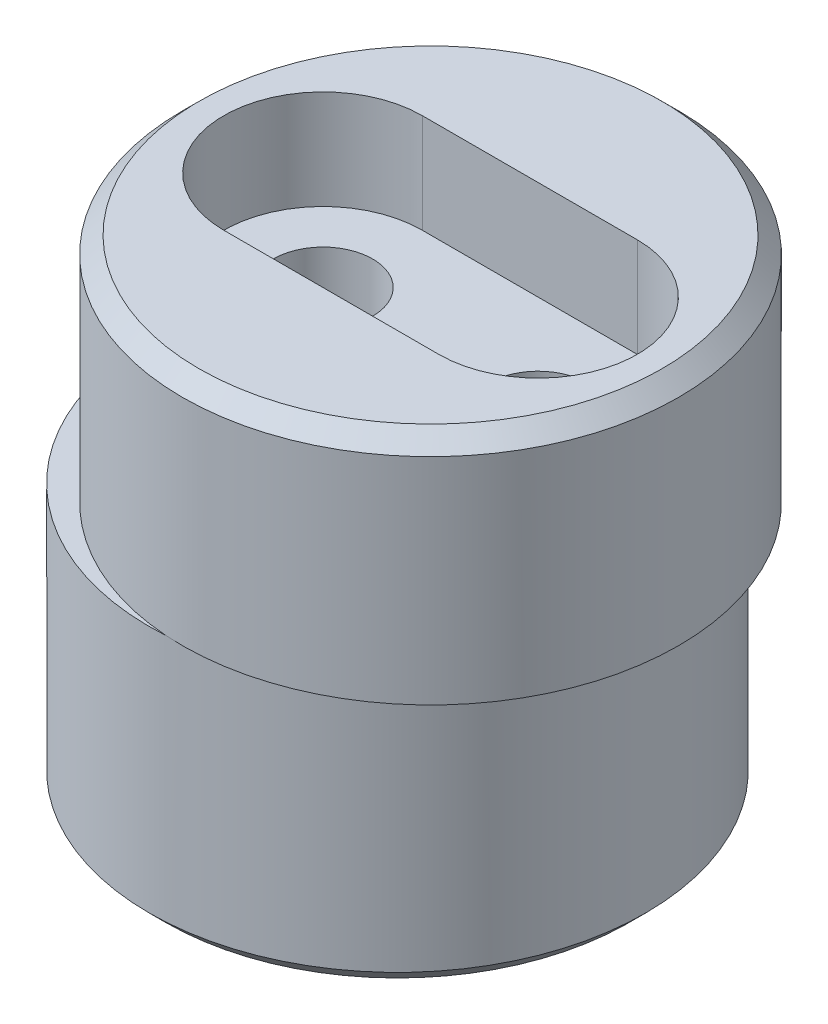
ISO-10303-21;
HEADER;
FILE_DESCRIPTION(('STEP AP214'),'2;1');
FILE_NAME('part.step','',(''),(''),'','','');
FILE_SCHEMA(('AUTOMOTIVE_DESIGN { 1 0 10303 214 1 1 1 1 }'));
ENDSEC;
DATA;
#1=APPLICATION_CONTEXT('core data for automotive mechanical design processes');
#2=APPLICATION_PROTOCOL_DEFINITION('international standard','automotive_design',2000,#1);
#3=PRODUCT_CONTEXT('',#1,'mechanical');
#4=PRODUCT('Part','Part','',(#3));
#5=PRODUCT_RELATED_PRODUCT_CATEGORY('part','',(#4));
#6=PRODUCT_DEFINITION_FORMATION('','',#4);
#7=PRODUCT_DEFINITION_CONTEXT('part definition',#1,'design');
#8=PRODUCT_DEFINITION('design','',#6,#7);
#9=PRODUCT_DEFINITION_SHAPE('','',#8);
#10=(LENGTH_UNIT() NAMED_UNIT(*) SI_UNIT(.MILLI.,.METRE.));
#11=(NAMED_UNIT(*) PLANE_ANGLE_UNIT() SI_UNIT($,.RADIAN.));
#12=(NAMED_UNIT(*) SI_UNIT($,.STERADIAN.) SOLID_ANGLE_UNIT());
#13=UNCERTAINTY_MEASURE_WITH_UNIT(LENGTH_MEASURE(1.E-05),#10,'distance_accuracy_value','');
#14=(GEOMETRIC_REPRESENTATION_CONTEXT(3) GLOBAL_UNCERTAINTY_ASSIGNED_CONTEXT((#13)) GLOBAL_UNIT_ASSIGNED_CONTEXT((#10,
#11,#12)) REPRESENTATION_CONTEXT('',''));
#15=CARTESIAN_POINT('',(0.,0.,0.));
#16=DIRECTION('',(0.,0.,1.));
#17=DIRECTION('',(1.,0.,0.));
#18=AXIS2_PLACEMENT_3D('',#15,#16,#17);
#19=CARTESIAN_POINT('',(4.25,0.,0.));
#20=DIRECTION('',(0.,1.,0.));
#21=DIRECTION('',(0.,0.,1.));
#22=AXIS2_PLACEMENT_3D('',#19,#20,#21);
#23=CYLINDRICAL_SURFACE('',#22,1.5);
#24=CARTESIAN_POINT('',(4.25,0.,0.));
#25=DIRECTION('',(0.,1.,0.));
#26=DIRECTION('',(0.,0.,1.));
#27=AXIS2_PLACEMENT_3D('',#24,#25,#26);
#28=CIRCLE('',#27,1.5);
#29=CARTESIAN_POINT('',(4.25,0.,1.5));
#30=VERTEX_POINT('',#29);
#31=EDGE_CURVE('E128',#30,#30,#28,.T.);
#32=ORIENTED_EDGE('',*,*,#31,.F.);
#33=EDGE_LOOP('',(#32));
#34=FACE_BOUND('',#33,.T.);
#35=CARTESIAN_POINT('',(4.25,12.,0.));
#36=DIRECTION('',(0.,1.,0.));
#37=DIRECTION('',(0.,0.,1.));
#38=AXIS2_PLACEMENT_3D('',#35,#36,#37);
#39=CIRCLE('',#38,1.5);
#40=CARTESIAN_POINT('',(4.25,12.,1.5));
#41=VERTEX_POINT('',#40);
#42=EDGE_CURVE('E125',#41,#41,#39,.F.);
#43=ORIENTED_EDGE('',*,*,#42,.F.);
#44=EDGE_LOOP('',(#43));
#45=FACE_BOUND('',#44,.T.);
#46=ADVANCED_FACE('F36',(#34,#45),#23,.F.);
#47=CARTESIAN_POINT('',(-2.25,0.,0.));
#48=DIRECTION('',(0.,1.,0.));
#49=DIRECTION('',(0.,0.,1.));
#50=AXIS2_PLACEMENT_3D('',#47,#48,#49);
#51=CYLINDRICAL_SURFACE('',#50,1.5);
#52=CARTESIAN_POINT('',(-2.25,0.,0.));
#53=DIRECTION('',(0.,1.,0.));
#54=DIRECTION('',(0.,0.,1.));
#55=AXIS2_PLACEMENT_3D('',#52,#53,#54);
#56=CIRCLE('',#55,1.5);
#57=CARTESIAN_POINT('',(-2.25,0.,1.5));
#58=VERTEX_POINT('',#57);
#59=EDGE_CURVE('E129',#58,#58,#56,.T.);
#60=ORIENTED_EDGE('',*,*,#59,.F.);
#61=EDGE_LOOP('',(#60));
#62=FACE_BOUND('',#61,.T.);
#63=CARTESIAN_POINT('',(-2.25,12.,0.));
#64=DIRECTION('',(0.,1.,0.));
#65=DIRECTION('',(0.,0.,1.));
#66=AXIS2_PLACEMENT_3D('',#63,#64,#65);
#67=CIRCLE('',#66,1.5);
#68=CARTESIAN_POINT('',(-2.25,12.,1.5));
#69=VERTEX_POINT('',#68);
#70=EDGE_CURVE('E121',#69,#69,#67,.F.);
#71=ORIENTED_EDGE('',*,*,#70,.F.);
#72=EDGE_LOOP('',(#71));
#73=FACE_BOUND('',#72,.T.);
#74=ADVANCED_FACE('F162',(#62,#73),#51,.F.);
#75=CARTESIAN_POINT('',(0.,8.,0.));
#76=DIRECTION('',(0.,-1.,0.));
#77=DIRECTION('',(0.,0.,-1.));
#78=AXIS2_PLACEMENT_3D('',#75,#76,#77);
#79=CYLINDRICAL_SURFACE('',#78,7.5);
#80=CARTESIAN_POINT('',(0.,0.5,0.));
#81=DIRECTION('',(0.,1.,0.));
#82=DIRECTION('',(0.,0.,1.));
#83=AXIS2_PLACEMENT_3D('',#80,#81,#82);
#84=CIRCLE('',#83,7.5);
#85=CARTESIAN_POINT('',(0.,0.5,7.5));
#86=VERTEX_POINT('',#85);
#87=EDGE_CURVE('E140',#86,#86,#84,.T.);
#88=ORIENTED_EDGE('',*,*,#87,.T.);
#89=EDGE_LOOP('',(#88));
#90=FACE_BOUND('',#89,.T.);
#91=CARTESIAN_POINT('',(0.,8.,0.));
#92=DIRECTION('',(0.,1.,0.));
#93=DIRECTION('',(0.,0.,1.));
#94=AXIS2_PLACEMENT_3D('',#91,#92,#93);
#95=CIRCLE('',#94,7.5);
#96=CARTESIAN_POINT('',(0.5,8.,7.48331477354788));
#97=VERTEX_POINT('',#96);
#98=CARTESIAN_POINT('',(0.5,8.,-7.48331477354788));
#99=VERTEX_POINT('',#98);
#100=EDGE_CURVE('E137',#97,#99,#95,.T.);
#101=ORIENTED_EDGE('',*,*,#100,.F.);
#102=EDGE_CURVE('E136',#99,#97,#95,.T.);
#103=ORIENTED_EDGE('',*,*,#102,.F.);
#104=EDGE_LOOP('',(#101,#103));
#105=FACE_BOUND('',#104,.T.);
#106=ADVANCED_FACE('F168',(#90,#105),#79,.T.);
#107=CARTESIAN_POINT('',(0.,8.,0.));
#108=DIRECTION('',(0.,1.,0.));
#109=DIRECTION('',(0.,0.,1.));
#110=AXIS2_PLACEMENT_3D('',#107,#108,#109);
#111=PLANE('',#110);
#112=CARTESIAN_POINT('',(1.,8.,0.));
#113=DIRECTION('',(0.,1.,0.));
#114=DIRECTION('',(0.,0.,1.));
#115=AXIS2_PLACEMENT_3D('',#112,#113,#114);
#116=CIRCLE('',#115,7.5);
#117=EDGE_CURVE('E59',#99,#97,#116,.T.);
#118=ORIENTED_EDGE('',*,*,#117,.F.);
#119=ORIENTED_EDGE('',*,*,#102,.T.);
#120=EDGE_LOOP('',(#118,#119));
#121=FACE_BOUND('',#120,.T.);
#122=ADVANCED_FACE('F186',(#121),#111,.T.);
#123=CARTESIAN_POINT('',(0.,0.,0.));
#124=DIRECTION('',(0.,1.,0.));
#125=DIRECTION('',(0.,0.,1.));
#126=AXIS2_PLACEMENT_3D('',#123,#124,#125);
#127=PLANE('',#126);
#128=CARTESIAN_POINT('',(0.,0.,0.));
#129=DIRECTION('',(0.,1.,0.));
#130=DIRECTION('',(0.,0.,1.));
#131=AXIS2_PLACEMENT_3D('',#128,#129,#130);
#132=CIRCLE('',#131,7.);
#133=CARTESIAN_POINT('',(0.,0.,7.));
#134=VERTEX_POINT('',#133);
#135=EDGE_CURVE('E145',#134,#134,#132,.F.);
#136=ORIENTED_EDGE('',*,*,#135,.T.);
#137=EDGE_LOOP('',(#136));
#138=FACE_BOUND('',#137,.T.);
#139=ORIENTED_EDGE('',*,*,#59,.T.);
#140=EDGE_LOOP('',(#139));
#141=FACE_BOUND('',#140,.T.);
#142=ORIENTED_EDGE('',*,*,#31,.T.);
#143=EDGE_LOOP('',(#142));
#144=FACE_BOUND('',#143,.T.);
#145=ADVANCED_FACE('F181',(#138,#141,#144),#127,.F.);
#146=CARTESIAN_POINT('',(1.,8.,0.));
#147=DIRECTION('',(0.,1.,0.));
#148=DIRECTION('',(0.,0.,1.));
#149=AXIS2_PLACEMENT_3D('',#146,#147,#148);
#150=PLANE('',#149);
#151=EDGE_CURVE('E132',#97,#99,#116,.T.);
#152=ORIENTED_EDGE('',*,*,#151,.F.);
#153=ORIENTED_EDGE('',*,*,#100,.T.);
#154=EDGE_LOOP('',(#152,#153));
#155=FACE_BOUND('',#154,.T.);
#156=ADVANCED_FACE('F178',(#155),#150,.F.);
#157=CARTESIAN_POINT('',(1.,15.,0.));
#158=DIRECTION('',(0.,-1.,0.));
#159=DIRECTION('',(0.,0.,-1.));
#160=AXIS2_PLACEMENT_3D('',#157,#158,#159);
#161=CYLINDRICAL_SURFACE('',#160,7.5);
#162=CARTESIAN_POINT('',(1.,14.5,0.));
#163=DIRECTION('',(0.,1.,0.));
#164=DIRECTION('',(0.,0.,1.));
#165=AXIS2_PLACEMENT_3D('',#162,#163,#164);
#166=CIRCLE('',#165,7.5);
#167=CARTESIAN_POINT('',(1.,14.5,7.5));
#168=VERTEX_POINT('',#167);
#169=EDGE_CURVE('E11',#168,#168,#166,.F.);
#170=ORIENTED_EDGE('',*,*,#169,.T.);
#171=EDGE_LOOP('',(#170));
#172=FACE_BOUND('',#171,.T.);
#173=ORIENTED_EDGE('',*,*,#117,.T.);
#174=ORIENTED_EDGE('',*,*,#151,.T.);
#175=EDGE_LOOP('',(#173,#174));
#176=FACE_BOUND('',#175,.T.);
#177=ADVANCED_FACE('F177',(#172,#176),#161,.T.);
#178=CARTESIAN_POINT('',(1.,15.,0.));
#179=DIRECTION('',(0.,1.,0.));
#180=DIRECTION('',(0.,0.,1.));
#181=AXIS2_PLACEMENT_3D('',#178,#179,#180);
#182=PLANE('',#181);
#183=CARTESIAN_POINT('',(1.,15.,0.));
#184=DIRECTION('',(0.,1.,0.));
#185=DIRECTION('',(0.,0.,1.));
#186=AXIS2_PLACEMENT_3D('',#183,#184,#185);
#187=CIRCLE('',#186,7.00000000000001);
#188=CARTESIAN_POINT('',(1.,15.,7.00000000000001));
#189=VERTEX_POINT('',#188);
#190=EDGE_CURVE('E45',#189,#189,#187,.T.);
#191=ORIENTED_EDGE('',*,*,#190,.T.);
#192=EDGE_LOOP('',(#191));
#193=FACE_BOUND('',#192,.T.);
#194=CARTESIAN_POINT('',(-2.25,15.,0.));
#195=DIRECTION('',(0.,1.,0.));
#196=DIRECTION('',(0.,0.,1.));
#197=AXIS2_PLACEMENT_3D('',#194,#195,#196);
#198=CIRCLE('',#197,3.);
#199=CARTESIAN_POINT('',(-2.25,15.,-3.));
#200=VERTEX_POINT('',#199);
#201=CARTESIAN_POINT('',(-2.25,15.,3.));
#202=VERTEX_POINT('',#201);
#203=EDGE_CURVE('E52',#200,#202,#198,.T.);
#204=ORIENTED_EDGE('',*,*,#203,.F.);
#205=DIRECTION('',(-1.,0.,0.));
#206=VECTOR('',#205,1.);
#207=CARTESIAN_POINT('',(-2.25,15.,-3.));
#208=LINE('',#207,#206);
#209=CARTESIAN_POINT('',(4.25,15.,-3.));
#210=VERTEX_POINT('',#209);
#211=EDGE_CURVE('E106',#210,#200,#208,.T.);
#212=ORIENTED_EDGE('',*,*,#211,.F.);
#213=CARTESIAN_POINT('',(4.25,15.,0.));
#214=DIRECTION('',(0.,1.,0.));
#215=DIRECTION('',(0.,0.,1.));
#216=AXIS2_PLACEMENT_3D('',#213,#214,#215);
#217=CIRCLE('',#216,3.);
#218=CARTESIAN_POINT('',(4.25,15.,3.));
#219=VERTEX_POINT('',#218);
#220=EDGE_CURVE('E109',#219,#210,#217,.T.);
#221=ORIENTED_EDGE('',*,*,#220,.F.);
#222=DIRECTION('',(1.,0.,0.));
#223=VECTOR('',#222,1.);
#224=CARTESIAN_POINT('',(-2.25,15.,3.));
#225=LINE('',#224,#223);
#226=EDGE_CURVE('E115',#202,#219,#225,.T.);
#227=ORIENTED_EDGE('',*,*,#226,.F.);
#228=EDGE_LOOP('',(#204,#212,#221,#227));
#229=FACE_BOUND('',#228,.T.);
#230=ADVANCED_FACE('F150',(#193,#229),#182,.T.);
#231=CARTESIAN_POINT('',(-2.25,12.,0.));
#232=DIRECTION('',(0.,1.,0.));
#233=DIRECTION('',(0.,0.,1.));
#234=AXIS2_PLACEMENT_3D('',#231,#232,#233);
#235=PLANE('',#234);
#236=CARTESIAN_POINT('',(-2.25,12.,0.));
#237=DIRECTION('',(0.,1.,0.));
#238=DIRECTION('',(0.,0.,1.));
#239=AXIS2_PLACEMENT_3D('',#236,#237,#238);
#240=CIRCLE('',#239,3.);
#241=CARTESIAN_POINT('',(-2.25,12.,-3.));
#242=VERTEX_POINT('',#241);
#243=CARTESIAN_POINT('',(-2.25,12.,3.));
#244=VERTEX_POINT('',#243);
#245=EDGE_CURVE('E87',#242,#244,#240,.T.);
#246=ORIENTED_EDGE('',*,*,#245,.T.);
#247=DIRECTION('',(1.,0.,0.));
#248=VECTOR('',#247,1.);
#249=CARTESIAN_POINT('',(-2.25,12.,3.));
#250=LINE('',#249,#248);
#251=CARTESIAN_POINT('',(4.25,12.,3.));
#252=VERTEX_POINT('',#251);
#253=EDGE_CURVE('E96',#244,#252,#250,.T.);
#254=ORIENTED_EDGE('',*,*,#253,.T.);
#255=CARTESIAN_POINT('',(4.25,12.,0.));
#256=DIRECTION('',(0.,1.,0.));
#257=DIRECTION('',(0.,0.,1.));
#258=AXIS2_PLACEMENT_3D('',#255,#256,#257);
#259=CIRCLE('',#258,3.);
#260=CARTESIAN_POINT('',(4.25,12.,-3.));
#261=VERTEX_POINT('',#260);
#262=EDGE_CURVE('E101',#252,#261,#259,.T.);
#263=ORIENTED_EDGE('',*,*,#262,.T.);
#264=DIRECTION('',(-1.,0.,0.));
#265=VECTOR('',#264,1.);
#266=CARTESIAN_POINT('',(-2.25,12.,-3.));
#267=LINE('',#266,#265);
#268=EDGE_CURVE('E93',#261,#242,#267,.T.);
#269=ORIENTED_EDGE('',*,*,#268,.T.);
#270=EDGE_LOOP('',(#246,#254,#263,#269));
#271=FACE_BOUND('',#270,.T.);
#272=ORIENTED_EDGE('',*,*,#70,.T.);
#273=EDGE_LOOP('',(#272));
#274=FACE_BOUND('',#273,.T.);
#275=ORIENTED_EDGE('',*,*,#42,.T.);
#276=EDGE_LOOP('',(#275));
#277=FACE_BOUND('',#276,.T.);
#278=ADVANCED_FACE('F103',(#271,#274,#277),#235,.T.);
#279=CARTESIAN_POINT('',(-2.25,12.,0.));
#280=DIRECTION('',(0.,1.,0.));
#281=DIRECTION('',(0.,0.,1.));
#282=AXIS2_PLACEMENT_3D('',#279,#280,#281);
#283=CYLINDRICAL_SURFACE('',#282,3.);
#284=ORIENTED_EDGE('',*,*,#203,.T.);
#285=DIRECTION('',(0.,1.,0.));
#286=VECTOR('',#285,1.);
#287=CARTESIAN_POINT('',(-2.25,12.,3.));
#288=LINE('',#287,#286);
#289=EDGE_CURVE('E83',#244,#202,#288,.T.);
#290=ORIENTED_EDGE('',*,*,#289,.F.);
#291=ORIENTED_EDGE('',*,*,#245,.F.);
#292=DIRECTION('',(0.,1.,0.));
#293=VECTOR('',#292,1.);
#294=CARTESIAN_POINT('',(-2.25,12.,-3.));
#295=LINE('',#294,#293);
#296=EDGE_CURVE('E119',#242,#200,#295,.T.);
#297=ORIENTED_EDGE('',*,*,#296,.T.);
#298=EDGE_LOOP('',(#284,#290,#291,#297));
#299=FACE_BOUND('',#298,.T.);
#300=ADVANCED_FACE('F85',(#299),#283,.F.);
#301=CARTESIAN_POINT('',(-2.25,12.,-3.));
#302=DIRECTION('',(0.,0.,-1.));
#303=DIRECTION('',(-1.,0.,0.));
#304=AXIS2_PLACEMENT_3D('',#301,#302,#303);
#305=PLANE('',#304);
#306=ORIENTED_EDGE('',*,*,#211,.T.);
#307=ORIENTED_EDGE('',*,*,#296,.F.);
#308=ORIENTED_EDGE('',*,*,#268,.F.);
#309=DIRECTION('',(0.,1.,0.));
#310=VECTOR('',#309,1.);
#311=CARTESIAN_POINT('',(4.25,12.,-3.));
#312=LINE('',#311,#310);
#313=EDGE_CURVE('E122',#261,#210,#312,.T.);
#314=ORIENTED_EDGE('',*,*,#313,.T.);
#315=EDGE_LOOP('',(#306,#307,#308,#314));
#316=FACE_BOUND('',#315,.T.);
#317=ADVANCED_FACE('F243',(#316),#305,.F.);
#318=CARTESIAN_POINT('',(4.25,12.,0.));
#319=DIRECTION('',(0.,1.,0.));
#320=DIRECTION('',(0.,0.,1.));
#321=AXIS2_PLACEMENT_3D('',#318,#319,#320);
#322=CYLINDRICAL_SURFACE('',#321,3.);
#323=ORIENTED_EDGE('',*,*,#220,.T.);
#324=ORIENTED_EDGE('',*,*,#313,.F.);
#325=ORIENTED_EDGE('',*,*,#262,.F.);
#326=DIRECTION('',(0.,1.,0.));
#327=VECTOR('',#326,1.);
#328=CARTESIAN_POINT('',(4.25,12.,3.));
#329=LINE('',#328,#327);
#330=EDGE_CURVE('E92',#252,#219,#329,.T.);
#331=ORIENTED_EDGE('',*,*,#330,.T.);
#332=EDGE_LOOP('',(#323,#324,#325,#331));
#333=FACE_BOUND('',#332,.T.);
#334=ADVANCED_FACE('F249',(#333),#322,.F.);
#335=CARTESIAN_POINT('',(-2.25,12.,3.));
#336=DIRECTION('',(0.,0.,1.));
#337=DIRECTION('',(1.,0.,0.));
#338=AXIS2_PLACEMENT_3D('',#335,#336,#337);
#339=PLANE('',#338);
#340=ORIENTED_EDGE('',*,*,#226,.T.);
#341=ORIENTED_EDGE('',*,*,#330,.F.);
#342=ORIENTED_EDGE('',*,*,#253,.F.);
#343=ORIENTED_EDGE('',*,*,#289,.T.);
#344=EDGE_LOOP('',(#340,#341,#342,#343));
#345=FACE_BOUND('',#344,.T.);
#346=ADVANCED_FACE('F97',(#345),#339,.F.);
#347=CARTESIAN_POINT('',(0.,0.5,0.));
#348=DIRECTION('',(0.,1.,0.));
#349=DIRECTION('',(0.,0.,1.));
#350=AXIS2_PLACEMENT_3D('',#347,#348,#349);
#351=CONICAL_SURFACE('',#350,7.5,0.785398163397448);
#352=ORIENTED_EDGE('',*,*,#135,.F.);
#353=EDGE_LOOP('',(#352));
#354=FACE_BOUND('',#353,.T.);
#355=ORIENTED_EDGE('',*,*,#87,.F.);
#356=EDGE_LOOP('',(#355));
#357=FACE_BOUND('',#356,.T.);
#358=ADVANCED_FACE('F154',(#354,#357),#351,.T.);
#359=CARTESIAN_POINT('',(1.,15.,0.));
#360=DIRECTION('',(0.,-1.,0.));
#361=DIRECTION('',(0.,0.,-1.));
#362=AXIS2_PLACEMENT_3D('',#359,#360,#361);
#363=CONICAL_SURFACE('',#362,7.00000000000001,0.785398163397444);
#364=ORIENTED_EDGE('',*,*,#169,.F.);
#365=EDGE_LOOP('',(#364));
#366=FACE_BOUND('',#365,.T.);
#367=ORIENTED_EDGE('',*,*,#190,.F.);
#368=EDGE_LOOP('',(#367));
#369=FACE_BOUND('',#368,.T.);
#370=ADVANCED_FACE('F39',(#366,#369),#363,.T.);
#371=CLOSED_SHELL('',(#46,#74,#106,#122,#145,#156,#177,#230,#278,#300,#317,#334,#346,#358,#370));
#372=MANIFOLD_SOLID_BREP('B2',#371);
#373=ADVANCED_BREP_SHAPE_REPRESENTATION('',(#18,#372),#14);
#374=SHAPE_DEFINITION_REPRESENTATION(#9,#373);
ENDSEC;
END-ISO-10303-21;
